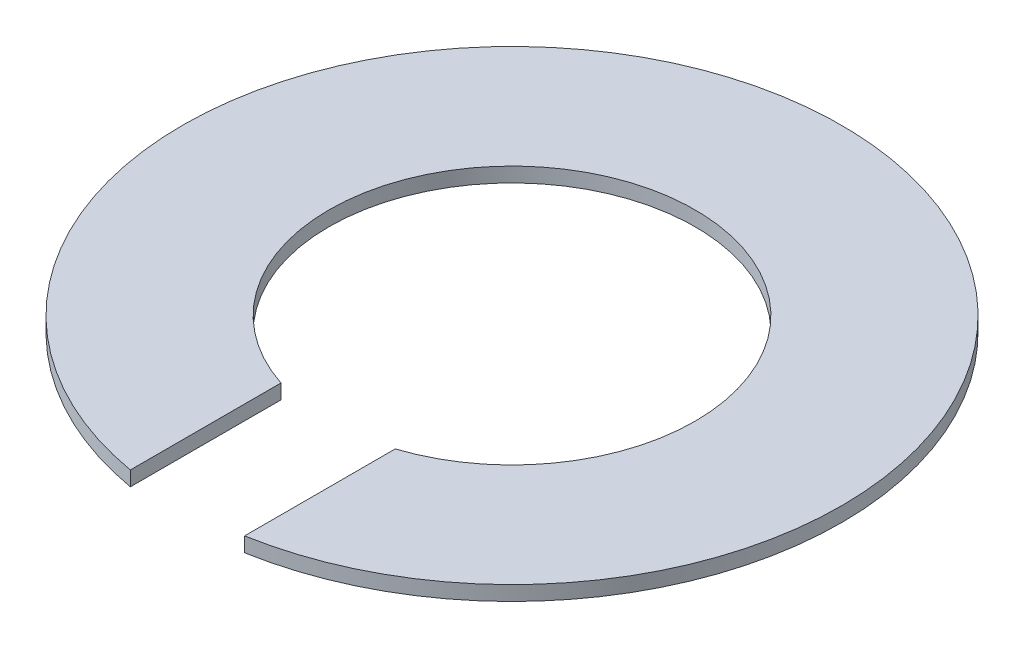
ISO-10303-21;
HEADER;
FILE_DESCRIPTION(('STEP AP214'),'2;1');
FILE_NAME('part.step','',(''),(''),'','','');
FILE_SCHEMA(('AUTOMOTIVE_DESIGN { 1 0 10303 214 1 1 1 1 }'));
ENDSEC;
DATA;
#1=APPLICATION_CONTEXT('core data for automotive mechanical design processes');
#2=APPLICATION_PROTOCOL_DEFINITION('international standard','automotive_design',2000,#1);
#3=PRODUCT_CONTEXT('',#1,'mechanical');
#4=PRODUCT('Part','Part','',(#3));
#5=PRODUCT_RELATED_PRODUCT_CATEGORY('part','',(#4));
#6=PRODUCT_DEFINITION_FORMATION('','',#4);
#7=PRODUCT_DEFINITION_CONTEXT('part definition',#1,'design');
#8=PRODUCT_DEFINITION('design','',#6,#7);
#9=PRODUCT_DEFINITION_SHAPE('','',#8);
#10=(LENGTH_UNIT() NAMED_UNIT(*) SI_UNIT(.MILLI.,.METRE.));
#11=(NAMED_UNIT(*) PLANE_ANGLE_UNIT() SI_UNIT($,.RADIAN.));
#12=(NAMED_UNIT(*) SI_UNIT($,.STERADIAN.) SOLID_ANGLE_UNIT());
#13=UNCERTAINTY_MEASURE_WITH_UNIT(LENGTH_MEASURE(1.E-05),#10,'distance_accuracy_value','');
#14=(GEOMETRIC_REPRESENTATION_CONTEXT(3) GLOBAL_UNCERTAINTY_ASSIGNED_CONTEXT((#13)) GLOBAL_UNIT_ASSIGNED_CONTEXT((#10,
#11,#12)) REPRESENTATION_CONTEXT('',''));
#15=CARTESIAN_POINT('',(0.,0.,0.));
#16=DIRECTION('',(0.,0.,1.));
#17=DIRECTION('',(1.,0.,0.));
#18=AXIS2_PLACEMENT_3D('',#15,#16,#17);
#19=CARTESIAN_POINT('',(0.,0.254,0.));
#20=DIRECTION('',(0.,-1.,0.));
#21=DIRECTION('',(0.,0.,-1.));
#22=AXIS2_PLACEMENT_3D('',#19,#20,#21);
#23=CYLINDRICAL_SURFACE('',#22,3.175);
#24=CARTESIAN_POINT('',(0.,0.,0.));
#25=DIRECTION('',(0.,1.,0.));
#26=DIRECTION('',(0.,0.,1.));
#27=AXIS2_PLACEMENT_3D('',#24,#25,#26);
#28=CIRCLE('',#27,3.175);
#29=CARTESIAN_POINT('',(0.990450861063572,0.,3.01655964499601));
#30=VERTEX_POINT('',#29);
#31=CARTESIAN_POINT('',(-0.990450861063572,0.,3.01655964499601));
#32=VERTEX_POINT('',#31);
#33=EDGE_CURVE('E115',#30,#32,#28,.T.);
#34=ORIENTED_EDGE('',*,*,#33,.F.);
#35=DIRECTION('',(0.,-1.,0.));
#36=VECTOR('',#35,1.);
#37=CARTESIAN_POINT('',(0.990450861063572,0.254,3.01655964499601));
#38=LINE('',#37,#36);
#39=CARTESIAN_POINT('',(0.990450861063572,0.254,3.01655964499601));
#40=VERTEX_POINT('',#39);
#41=EDGE_CURVE('E11',#40,#30,#38,.T.);
#42=ORIENTED_EDGE('',*,*,#41,.F.);
#43=CARTESIAN_POINT('',(0.,0.254,0.));
#44=DIRECTION('',(0.,1.,0.));
#45=DIRECTION('',(0.,0.,1.));
#46=AXIS2_PLACEMENT_3D('',#43,#44,#45);
#47=CIRCLE('',#46,3.175);
#48=CARTESIAN_POINT('',(-0.990450861063572,0.254,3.01655964499601));
#49=VERTEX_POINT('',#48);
#50=EDGE_CURVE('E96',#40,#49,#47,.T.);
#51=ORIENTED_EDGE('',*,*,#50,.T.);
#52=DIRECTION('',(0.,-1.,0.));
#53=VECTOR('',#52,1.);
#54=CARTESIAN_POINT('',(-0.990450861063572,0.254,3.01655964499601));
#55=LINE('',#54,#53);
#56=EDGE_CURVE('E64',#49,#32,#55,.T.);
#57=ORIENTED_EDGE('',*,*,#56,.T.);
#58=EDGE_LOOP('',(#34,#42,#51,#57));
#59=FACE_BOUND('',#58,.T.);
#60=ADVANCED_FACE('F47',(#59),#23,.F.);
#61=CARTESIAN_POINT('',(0.990450861063572,0.254,0.));
#62=DIRECTION('',(1.,0.,0.));
#63=DIRECTION('',(0.,0.,-1.));
#64=AXIS2_PLACEMENT_3D('',#61,#62,#63);
#65=PLANE('',#64);
#66=DIRECTION('',(0.,0.,1.));
#67=VECTOR('',#66,1.);
#68=CARTESIAN_POINT('',(0.990450861063572,0.,0.));
#69=LINE('',#68,#67);
#70=CARTESIAN_POINT('',(0.990450861063572,0.,5.6285195293095));
#71=VERTEX_POINT('',#70);
#72=EDGE_CURVE('E103',#30,#71,#69,.T.);
#73=ORIENTED_EDGE('',*,*,#72,.T.);
#74=DIRECTION('',(0.,-1.,0.));
#75=VECTOR('',#74,1.);
#76=CARTESIAN_POINT('',(0.990450861063572,0.254,5.6285195293095));
#77=LINE('',#76,#75);
#78=CARTESIAN_POINT('',(0.990450861063572,0.254,5.6285195293095));
#79=VERTEX_POINT('',#78);
#80=EDGE_CURVE('E56',#79,#71,#77,.T.);
#81=ORIENTED_EDGE('',*,*,#80,.F.);
#82=DIRECTION('',(0.,0.,1.));
#83=VECTOR('',#82,1.);
#84=CARTESIAN_POINT('',(0.990450861063572,0.254,0.));
#85=LINE('',#84,#83);
#86=EDGE_CURVE('E90',#40,#79,#85,.T.);
#87=ORIENTED_EDGE('',*,*,#86,.F.);
#88=ORIENTED_EDGE('',*,*,#41,.T.);
#89=EDGE_LOOP('',(#73,#81,#87,#88));
#90=FACE_BOUND('',#89,.T.);
#91=ADVANCED_FACE('F101',(#90),#65,.F.);
#92=CARTESIAN_POINT('',(0.,0.254,0.));
#93=DIRECTION('',(0.,-1.,0.));
#94=DIRECTION('',(0.,0.,-1.));
#95=AXIS2_PLACEMENT_3D('',#92,#93,#94);
#96=CYLINDRICAL_SURFACE('',#95,5.715);
#97=CARTESIAN_POINT('',(0.,0.,0.));
#98=DIRECTION('',(0.,1.,0.));
#99=DIRECTION('',(0.,0.,1.));
#100=AXIS2_PLACEMENT_3D('',#97,#98,#99);
#101=CIRCLE('',#100,5.715);
#102=CARTESIAN_POINT('',(-0.990450861063572,0.,5.6285195293095));
#103=VERTEX_POINT('',#102);
#104=EDGE_CURVE('E120',#71,#103,#101,.T.);
#105=ORIENTED_EDGE('',*,*,#104,.T.);
#106=DIRECTION('',(0.,-1.,0.));
#107=VECTOR('',#106,1.);
#108=CARTESIAN_POINT('',(-0.990450861063572,0.254,5.6285195293095));
#109=LINE('',#108,#107);
#110=CARTESIAN_POINT('',(-0.990450861063572,0.254,5.6285195293095));
#111=VERTEX_POINT('',#110);
#112=EDGE_CURVE('E78',#111,#103,#109,.T.);
#113=ORIENTED_EDGE('',*,*,#112,.F.);
#114=CARTESIAN_POINT('',(0.,0.254,0.));
#115=DIRECTION('',(0.,1.,0.));
#116=DIRECTION('',(0.,0.,1.));
#117=AXIS2_PLACEMENT_3D('',#114,#115,#116);
#118=CIRCLE('',#117,5.715);
#119=EDGE_CURVE('E95',#79,#111,#118,.T.);
#120=ORIENTED_EDGE('',*,*,#119,.F.);
#121=ORIENTED_EDGE('',*,*,#80,.T.);
#122=EDGE_LOOP('',(#105,#113,#120,#121));
#123=FACE_BOUND('',#122,.T.);
#124=ADVANCED_FACE('F107',(#123),#96,.T.);
#125=CARTESIAN_POINT('',(-0.990450861063572,0.254,0.));
#126=DIRECTION('',(1.,0.,0.));
#127=DIRECTION('',(0.,0.,-1.));
#128=AXIS2_PLACEMENT_3D('',#125,#126,#127);
#129=PLANE('',#128);
#130=DIRECTION('',(0.,0.,1.));
#131=VECTOR('',#130,1.);
#132=CARTESIAN_POINT('',(-0.990450861063572,0.,0.));
#133=LINE('',#132,#131);
#134=EDGE_CURVE('E123',#32,#103,#133,.T.);
#135=ORIENTED_EDGE('',*,*,#134,.F.);
#136=ORIENTED_EDGE('',*,*,#56,.F.);
#137=DIRECTION('',(0.,0.,1.));
#138=VECTOR('',#137,1.);
#139=CARTESIAN_POINT('',(-0.990450861063572,0.254,0.));
#140=LINE('',#139,#138);
#141=EDGE_CURVE('E109',#49,#111,#140,.T.);
#142=ORIENTED_EDGE('',*,*,#141,.T.);
#143=ORIENTED_EDGE('',*,*,#112,.T.);
#144=EDGE_LOOP('',(#135,#136,#142,#143));
#145=FACE_BOUND('',#144,.T.);
#146=ADVANCED_FACE('F132',(#145),#129,.T.);
#147=CARTESIAN_POINT('',(0.,0.254,0.));
#148=DIRECTION('',(0.,1.,0.));
#149=DIRECTION('',(0.,0.,1.));
#150=AXIS2_PLACEMENT_3D('',#147,#148,#149);
#151=PLANE('',#150);
#152=ORIENTED_EDGE('',*,*,#50,.F.);
#153=ORIENTED_EDGE('',*,*,#86,.T.);
#154=ORIENTED_EDGE('',*,*,#119,.T.);
#155=ORIENTED_EDGE('',*,*,#141,.F.);
#156=EDGE_LOOP('',(#152,#153,#154,#155));
#157=FACE_BOUND('',#156,.T.);
#158=ADVANCED_FACE('F92',(#157),#151,.T.);
#159=CARTESIAN_POINT('',(0.,0.,0.));
#160=DIRECTION('',(0.,1.,0.));
#161=DIRECTION('',(0.,0.,1.));
#162=AXIS2_PLACEMENT_3D('',#159,#160,#161);
#163=PLANE('',#162);
#164=ORIENTED_EDGE('',*,*,#33,.T.);
#165=ORIENTED_EDGE('',*,*,#134,.T.);
#166=ORIENTED_EDGE('',*,*,#104,.F.);
#167=ORIENTED_EDGE('',*,*,#72,.F.);
#168=EDGE_LOOP('',(#164,#165,#166,#167));
#169=FACE_BOUND('',#168,.T.);
#170=ADVANCED_FACE('F139',(#169),#163,.F.);
#171=CLOSED_SHELL('',(#60,#91,#124,#146,#158,#170));
#172=MANIFOLD_SOLID_BREP('B2',#171);
#173=ADVANCED_BREP_SHAPE_REPRESENTATION('',(#18,#172),#14);
#174=SHAPE_DEFINITION_REPRESENTATION(#9,#173);
ENDSEC;
END-ISO-10303-21;
